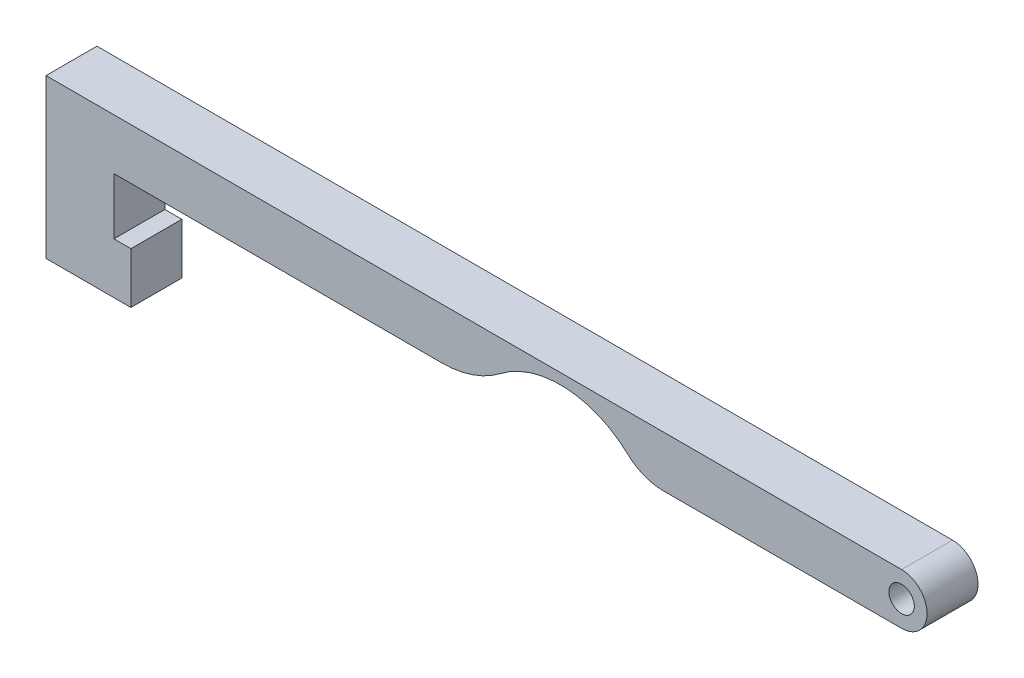
ISO-10303-21;
HEADER;
FILE_DESCRIPTION(('STEP AP214'),'2;1');
FILE_NAME('part.step','',(''),(''),'','','');
FILE_SCHEMA(('AUTOMOTIVE_DESIGN { 1 0 10303 214 1 1 1 1 }'));
ENDSEC;
DATA;
#1=APPLICATION_CONTEXT('core data for automotive mechanical design processes');
#2=APPLICATION_PROTOCOL_DEFINITION('international standard','automotive_design',2000,#1);
#3=PRODUCT_CONTEXT('',#1,'mechanical');
#4=PRODUCT('Part','Part','',(#3));
#5=PRODUCT_RELATED_PRODUCT_CATEGORY('part','',(#4));
#6=PRODUCT_DEFINITION_FORMATION('','',#4);
#7=PRODUCT_DEFINITION_CONTEXT('part definition',#1,'design');
#8=PRODUCT_DEFINITION('design','',#6,#7);
#9=PRODUCT_DEFINITION_SHAPE('','',#8);
#10=(LENGTH_UNIT() NAMED_UNIT(*) SI_UNIT(.MILLI.,.METRE.));
#11=(NAMED_UNIT(*) PLANE_ANGLE_UNIT() SI_UNIT($,.RADIAN.));
#12=(NAMED_UNIT(*) SI_UNIT($,.STERADIAN.) SOLID_ANGLE_UNIT());
#13=UNCERTAINTY_MEASURE_WITH_UNIT(LENGTH_MEASURE(1.E-05),#10,'distance_accuracy_value','');
#14=(GEOMETRIC_REPRESENTATION_CONTEXT(3) GLOBAL_UNCERTAINTY_ASSIGNED_CONTEXT((#13)) GLOBAL_UNIT_ASSIGNED_CONTEXT((#10,
#11,#12)) REPRESENTATION_CONTEXT('',''));
#15=CARTESIAN_POINT('',(0.,0.,0.));
#16=DIRECTION('',(0.,0.,1.));
#17=DIRECTION('',(1.,0.,0.));
#18=AXIS2_PLACEMENT_3D('',#15,#16,#17);
#19=CARTESIAN_POINT('',(503.852842171403,78.2849285036523,30.));
#20=DIRECTION('',(0.,0.,1.));
#21=DIRECTION('',(1.,0.,0.));
#22=AXIS2_PLACEMENT_3D('',#19,#20,#21);
#23=PLANE('',#22);
#24=DIRECTION('',(0.,1.,0.));
#25=VECTOR('',#24,1.);
#26=CARTESIAN_POINT('',(50.,30.,30.));
#27=LINE('',#26,#25);
#28=CARTESIAN_POINT('',(50.,0.,30.));
#29=VERTEX_POINT('',#28);
#30=CARTESIAN_POINT('',(50.,30.,30.));
#31=VERTEX_POINT('',#30);
#32=EDGE_CURVE('E200',#29,#31,#27,.T.);
#33=ORIENTED_EDGE('',*,*,#32,.T.);
#34=DIRECTION('',(-1.,0.,0.));
#35=VECTOR('',#34,1.);
#36=CARTESIAN_POINT('',(40.,30.,30.));
#37=LINE('',#36,#35);
#38=CARTESIAN_POINT('',(40.,30.,30.));
#39=VERTEX_POINT('',#38);
#40=EDGE_CURVE('E112',#31,#39,#37,.T.);
#41=ORIENTED_EDGE('',*,*,#40,.T.);
#42=DIRECTION('',(0.,1.,0.));
#43=VECTOR('',#42,1.);
#44=CARTESIAN_POINT('',(40.,63.2849285036523,30.));
#45=LINE('',#44,#43);
#46=CARTESIAN_POINT('',(40.,63.2849285036523,30.));
#47=VERTEX_POINT('',#46);
#48=EDGE_CURVE('E237',#39,#47,#45,.T.);
#49=ORIENTED_EDGE('',*,*,#48,.T.);
#50=DIRECTION('',(1.,0.,0.));
#51=VECTOR('',#50,1.);
#52=CARTESIAN_POINT('',(233.036577982899,63.2849285036523,30.));
#53=LINE('',#52,#51);
#54=CARTESIAN_POINT('',(233.036577982899,63.2849285036523,30.));
#55=VERTEX_POINT('',#54);
#56=EDGE_CURVE('E257',#47,#55,#53,.T.);
#57=ORIENTED_EDGE('',*,*,#56,.T.);
#58=CARTESIAN_POINT('',(233.036577982899,119.610355339386,30.));
#59=DIRECTION('',(0.,0.,1.));
#60=DIRECTION('',(-1.,0.,0.));
#61=AXIS2_PLACEMENT_3D('',#58,#59,#60);
#62=CIRCLE('',#61,56.3254268357336);
#63=CARTESIAN_POINT('',(267.394723934218,74.9777269716157,30.));
#64=VERTEX_POINT('',#63);
#65=EDGE_CURVE('E253',#55,#64,#62,.T.);
#66=ORIENTED_EDGE('',*,*,#65,.T.);
#67=CARTESIAN_POINT('',(302.941201104448,28.8014080407211,30.));
#68=DIRECTION('',(0.,0.,-1.));
#69=DIRECTION('',(1.,0.,0.));
#70=AXIS2_PLACEMENT_3D('',#67,#68,#69);
#71=CIRCLE('',#70,58.2735314634473);
#72=CARTESIAN_POINT('',(342.676664352432,71.4264878610504,30.));
#73=VERTEX_POINT('',#72);
#74=EDGE_CURVE('E256',#64,#73,#71,.T.);
#75=ORIENTED_EDGE('',*,*,#74,.T.);
#76=CARTESIAN_POINT('',(363.350187842499,93.6034179104629,30.));
#77=DIRECTION('',(0.,0.,1.));
#78=DIRECTION('',(-1.,0.,0.));
#79=AXIS2_PLACEMENT_3D('',#76,#77,#78);
#80=CIRCLE('',#79,30.3184894068106);
#81=CARTESIAN_POINT('',(363.350187842499,63.2849285036523,30.));
#82=VERTEX_POINT('',#81);
#83=EDGE_CURVE('E261',#73,#82,#80,.T.);
#84=ORIENTED_EDGE('',*,*,#83,.T.);
#85=DIRECTION('',(1.,0.,0.));
#86=VECTOR('',#85,1.);
#87=CARTESIAN_POINT('',(503.852842171403,63.2849285036523,30.));
#88=LINE('',#87,#86);
#89=CARTESIAN_POINT('',(503.852842171403,63.2849285036523,30.));
#90=VERTEX_POINT('',#89);
#91=EDGE_CURVE('E268',#82,#90,#88,.T.);
#92=ORIENTED_EDGE('',*,*,#91,.T.);
#93=CARTESIAN_POINT('',(503.852842171403,78.2849285036523,30.));
#94=DIRECTION('',(0.,0.,1.));
#95=DIRECTION('',(1.,0.,0.));
#96=AXIS2_PLACEMENT_3D('',#93,#94,#95);
#97=CIRCLE('',#96,15.);
#98=CARTESIAN_POINT('',(503.852842171403,93.2849285036523,30.));
#99=VERTEX_POINT('',#98);
#100=EDGE_CURVE('E143',#90,#99,#97,.T.);
#101=ORIENTED_EDGE('',*,*,#100,.T.);
#102=DIRECTION('',(-1.,0.,0.));
#103=VECTOR('',#102,1.);
#104=CARTESIAN_POINT('',(0.,93.2849285036523,30.));
#105=LINE('',#104,#103);
#106=CARTESIAN_POINT('',(0.,93.2849285036523,30.));
#107=VERTEX_POINT('',#106);
#108=EDGE_CURVE('E137',#99,#107,#105,.T.);
#109=ORIENTED_EDGE('',*,*,#108,.T.);
#110=DIRECTION('',(0.,-1.,0.));
#111=VECTOR('',#110,1.);
#112=CARTESIAN_POINT('',(0.,0.,30.));
#113=LINE('',#112,#111);
#114=CARTESIAN_POINT('',(0.,0.,30.));
#115=VERTEX_POINT('',#114);
#116=EDGE_CURVE('E141',#107,#115,#113,.T.);
#117=ORIENTED_EDGE('',*,*,#116,.T.);
#118=DIRECTION('',(1.,0.,0.));
#119=VECTOR('',#118,1.);
#120=CARTESIAN_POINT('',(50.,0.,30.));
#121=LINE('',#120,#119);
#122=EDGE_CURVE('E57',#115,#29,#121,.T.);
#123=ORIENTED_EDGE('',*,*,#122,.T.);
#124=EDGE_LOOP('',(#33,#41,#49,#57,#66,#75,#84,#92,#101,#109,#117,#123));
#125=FACE_BOUND('',#124,.T.);
#126=CARTESIAN_POINT('',(503.852842171403,78.2849285036523,30.));
#127=DIRECTION('',(0.,0.,1.));
#128=DIRECTION('',(1.,0.,0.));
#129=AXIS2_PLACEMENT_3D('',#126,#127,#128);
#130=CIRCLE('',#129,7.49999999999996);
#131=CARTESIAN_POINT('',(511.352842171403,78.2849285036523,30.));
#132=VERTEX_POINT('',#131);
#133=EDGE_CURVE('E170',#132,#132,#130,.T.);
#134=ORIENTED_EDGE('',*,*,#133,.F.);
#135=EDGE_LOOP('',(#134));
#136=FACE_BOUND('',#135,.T.);
#137=ADVANCED_FACE('F39',(#125,#136),#23,.T.);
#138=CARTESIAN_POINT('',(503.852842171403,78.2849285036523,0.));
#139=DIRECTION('',(0.,0.,1.));
#140=DIRECTION('',(1.,0.,0.));
#141=AXIS2_PLACEMENT_3D('',#138,#139,#140);
#142=PLANE('',#141);
#143=DIRECTION('',(0.,1.,0.));
#144=VECTOR('',#143,1.);
#145=CARTESIAN_POINT('',(50.,30.,0.));
#146=LINE('',#145,#144);
#147=CARTESIAN_POINT('',(50.,0.,0.));
#148=VERTEX_POINT('',#147);
#149=CARTESIAN_POINT('',(50.,30.,0.));
#150=VERTEX_POINT('',#149);
#151=EDGE_CURVE('E165',#148,#150,#146,.T.);
#152=ORIENTED_EDGE('',*,*,#151,.F.);
#153=DIRECTION('',(1.,0.,0.));
#154=VECTOR('',#153,1.);
#155=CARTESIAN_POINT('',(50.,0.,0.));
#156=LINE('',#155,#154);
#157=CARTESIAN_POINT('',(0.,0.,0.));
#158=VERTEX_POINT('',#157);
#159=EDGE_CURVE('E104',#158,#148,#156,.T.);
#160=ORIENTED_EDGE('',*,*,#159,.F.);
#161=DIRECTION('',(0.,-1.,0.));
#162=VECTOR('',#161,1.);
#163=CARTESIAN_POINT('',(0.,0.,0.));
#164=LINE('',#163,#162);
#165=CARTESIAN_POINT('',(0.,93.2849285036523,0.));
#166=VERTEX_POINT('',#165);
#167=EDGE_CURVE('E98',#166,#158,#164,.T.);
#168=ORIENTED_EDGE('',*,*,#167,.F.);
#169=DIRECTION('',(-1.,0.,0.));
#170=VECTOR('',#169,1.);
#171=CARTESIAN_POINT('',(0.,93.2849285036523,0.));
#172=LINE('',#171,#170);
#173=CARTESIAN_POINT('',(503.852842171403,93.2849285036523,0.));
#174=VERTEX_POINT('',#173);
#175=EDGE_CURVE('E152',#174,#166,#172,.T.);
#176=ORIENTED_EDGE('',*,*,#175,.F.);
#177=CARTESIAN_POINT('',(503.852842171403,78.2849285036523,0.));
#178=DIRECTION('',(0.,0.,1.));
#179=DIRECTION('',(1.,0.,0.));
#180=AXIS2_PLACEMENT_3D('',#177,#178,#179);
#181=CIRCLE('',#180,15.);
#182=CARTESIAN_POINT('',(503.852842171403,63.2849285036523,0.));
#183=VERTEX_POINT('',#182);
#184=EDGE_CURVE('E191',#183,#174,#181,.T.);
#185=ORIENTED_EDGE('',*,*,#184,.F.);
#186=DIRECTION('',(1.,0.,0.));
#187=VECTOR('',#186,1.);
#188=CARTESIAN_POINT('',(503.852842171403,63.2849285036523,0.));
#189=LINE('',#188,#187);
#190=CARTESIAN_POINT('',(363.350187842499,63.2849285036523,0.));
#191=VERTEX_POINT('',#190);
#192=EDGE_CURVE('E188',#191,#183,#189,.T.);
#193=ORIENTED_EDGE('',*,*,#192,.F.);
#194=CARTESIAN_POINT('',(363.350187842499,93.6034179104629,0.));
#195=DIRECTION('',(0.,0.,1.));
#196=DIRECTION('',(-1.,0.,0.));
#197=AXIS2_PLACEMENT_3D('',#194,#195,#196);
#198=CIRCLE('',#197,30.3184894068106);
#199=CARTESIAN_POINT('',(342.676664352432,71.4264878610504,0.));
#200=VERTEX_POINT('',#199);
#201=EDGE_CURVE('E185',#200,#191,#198,.T.);
#202=ORIENTED_EDGE('',*,*,#201,.F.);
#203=CARTESIAN_POINT('',(302.941201104448,28.8014080407211,0.));
#204=DIRECTION('',(0.,0.,-1.));
#205=DIRECTION('',(1.,0.,0.));
#206=AXIS2_PLACEMENT_3D('',#203,#204,#205);
#207=CIRCLE('',#206,58.2735314634473);
#208=CARTESIAN_POINT('',(267.394723934218,74.9777269716157,0.));
#209=VERTEX_POINT('',#208);
#210=EDGE_CURVE('E182',#209,#200,#207,.T.);
#211=ORIENTED_EDGE('',*,*,#210,.F.);
#212=CARTESIAN_POINT('',(233.036577982899,119.610355339386,0.));
#213=DIRECTION('',(0.,0.,1.));
#214=DIRECTION('',(-1.,0.,0.));
#215=AXIS2_PLACEMENT_3D('',#212,#213,#214);
#216=CIRCLE('',#215,56.3254268357336);
#217=CARTESIAN_POINT('',(233.036577982899,63.2849285036523,0.));
#218=VERTEX_POINT('',#217);
#219=EDGE_CURVE('E179',#218,#209,#216,.T.);
#220=ORIENTED_EDGE('',*,*,#219,.F.);
#221=DIRECTION('',(1.,0.,0.));
#222=VECTOR('',#221,1.);
#223=CARTESIAN_POINT('',(233.036577982899,63.2849285036523,0.));
#224=LINE('',#223,#222);
#225=CARTESIAN_POINT('',(40.,63.2849285036523,0.));
#226=VERTEX_POINT('',#225);
#227=EDGE_CURVE('E176',#226,#218,#224,.T.);
#228=ORIENTED_EDGE('',*,*,#227,.F.);
#229=DIRECTION('',(0.,1.,0.));
#230=VECTOR('',#229,1.);
#231=CARTESIAN_POINT('',(40.,63.2849285036523,0.));
#232=LINE('',#231,#230);
#233=CARTESIAN_POINT('',(40.,30.,0.));
#234=VERTEX_POINT('',#233);
#235=EDGE_CURVE('E173',#234,#226,#232,.T.);
#236=ORIENTED_EDGE('',*,*,#235,.F.);
#237=DIRECTION('',(-1.,0.,0.));
#238=VECTOR('',#237,1.);
#239=CARTESIAN_POINT('',(40.,30.,0.));
#240=LINE('',#239,#238);
#241=EDGE_CURVE('E169',#150,#234,#240,.T.);
#242=ORIENTED_EDGE('',*,*,#241,.F.);
#243=EDGE_LOOP('',(#152,#160,#168,#176,#185,#193,#202,#211,#220,#228,#236,#242));
#244=FACE_BOUND('',#243,.T.);
#245=CARTESIAN_POINT('',(503.852842171403,78.2849285036523,0.));
#246=DIRECTION('',(0.,0.,1.));
#247=DIRECTION('',(1.,0.,0.));
#248=AXIS2_PLACEMENT_3D('',#245,#246,#247);
#249=CIRCLE('',#248,7.49999999999996);
#250=CARTESIAN_POINT('',(511.352842171403,78.2849285036523,0.));
#251=VERTEX_POINT('',#250);
#252=EDGE_CURVE('E417',#251,#251,#249,.T.);
#253=ORIENTED_EDGE('',*,*,#252,.T.);
#254=EDGE_LOOP('',(#253));
#255=FACE_BOUND('',#254,.T.);
#256=ADVANCED_FACE('F241',(#244,#255),#142,.F.);
#257=CARTESIAN_POINT('',(50.,30.,30.));
#258=DIRECTION('',(-1.,0.,0.));
#259=DIRECTION('',(0.,0.,1.));
#260=AXIS2_PLACEMENT_3D('',#257,#258,#259);
#261=PLANE('',#260);
#262=ORIENTED_EDGE('',*,*,#151,.T.);
#263=DIRECTION('',(0.,0.,-1.));
#264=VECTOR('',#263,1.);
#265=CARTESIAN_POINT('',(50.,30.,30.));
#266=LINE('',#265,#264);
#267=EDGE_CURVE('E11',#31,#150,#266,.T.);
#268=ORIENTED_EDGE('',*,*,#267,.F.);
#269=ORIENTED_EDGE('',*,*,#32,.F.);
#270=DIRECTION('',(0.,0.,-1.));
#271=VECTOR('',#270,1.);
#272=CARTESIAN_POINT('',(50.,0.,30.));
#273=LINE('',#272,#271);
#274=EDGE_CURVE('E161',#29,#148,#273,.T.);
#275=ORIENTED_EDGE('',*,*,#274,.T.);
#276=EDGE_LOOP('',(#262,#268,#269,#275));
#277=FACE_BOUND('',#276,.T.);
#278=ADVANCED_FACE('F41',(#277),#261,.F.);
#279=CARTESIAN_POINT('',(40.,30.,30.));
#280=DIRECTION('',(0.,-1.,0.));
#281=DIRECTION('',(0.,0.,-1.));
#282=AXIS2_PLACEMENT_3D('',#279,#280,#281);
#283=PLANE('',#282);
#284=ORIENTED_EDGE('',*,*,#241,.T.);
#285=DIRECTION('',(0.,0.,-1.));
#286=VECTOR('',#285,1.);
#287=CARTESIAN_POINT('',(40.,30.,30.));
#288=LINE('',#287,#286);
#289=EDGE_CURVE('E49',#39,#234,#288,.T.);
#290=ORIENTED_EDGE('',*,*,#289,.F.);
#291=ORIENTED_EDGE('',*,*,#40,.F.);
#292=ORIENTED_EDGE('',*,*,#267,.T.);
#293=EDGE_LOOP('',(#284,#290,#291,#292));
#294=FACE_BOUND('',#293,.T.);
#295=ADVANCED_FACE('F304',(#294),#283,.F.);
#296=CARTESIAN_POINT('',(40.,63.2849285036523,30.));
#297=DIRECTION('',(-1.,0.,0.));
#298=DIRECTION('',(0.,0.,1.));
#299=AXIS2_PLACEMENT_3D('',#296,#297,#298);
#300=PLANE('',#299);
#301=ORIENTED_EDGE('',*,*,#235,.T.);
#302=DIRECTION('',(0.,0.,-1.));
#303=VECTOR('',#302,1.);
#304=CARTESIAN_POINT('',(40.,63.2849285036523,30.));
#305=LINE('',#304,#303);
#306=EDGE_CURVE('E227',#47,#226,#305,.T.);
#307=ORIENTED_EDGE('',*,*,#306,.F.);
#308=ORIENTED_EDGE('',*,*,#48,.F.);
#309=ORIENTED_EDGE('',*,*,#289,.T.);
#310=EDGE_LOOP('',(#301,#307,#308,#309));
#311=FACE_BOUND('',#310,.T.);
#312=ADVANCED_FACE('F235',(#311),#300,.F.);
#313=CARTESIAN_POINT('',(233.036577982899,63.2849285036523,30.));
#314=DIRECTION('',(0.,1.,0.));
#315=DIRECTION('',(-1.,0.,0.));
#316=AXIS2_PLACEMENT_3D('',#313,#314,#315);
#317=PLANE('',#316);
#318=ORIENTED_EDGE('',*,*,#227,.T.);
#319=DIRECTION('',(0.,0.,-1.));
#320=VECTOR('',#319,1.);
#321=CARTESIAN_POINT('',(233.036577982899,63.2849285036523,30.));
#322=LINE('',#321,#320);
#323=EDGE_CURVE('E223',#55,#218,#322,.T.);
#324=ORIENTED_EDGE('',*,*,#323,.F.);
#325=ORIENTED_EDGE('',*,*,#56,.F.);
#326=ORIENTED_EDGE('',*,*,#306,.T.);
#327=EDGE_LOOP('',(#318,#324,#325,#326));
#328=FACE_BOUND('',#327,.T.);
#329=ADVANCED_FACE('F247',(#328),#317,.F.);
#330=CARTESIAN_POINT('',(233.036577982899,119.610355339386,30.));
#331=DIRECTION('',(0.,0.,-1.));
#332=DIRECTION('',(-1.,0.,0.));
#333=AXIS2_PLACEMENT_3D('',#330,#331,#332);
#334=CYLINDRICAL_SURFACE('',#333,56.3254268357336);
#335=ORIENTED_EDGE('',*,*,#219,.T.);
#336=DIRECTION('',(0.,0.,-1.));
#337=VECTOR('',#336,1.);
#338=CARTESIAN_POINT('',(267.394723934218,74.9777269716157,30.));
#339=LINE('',#338,#337);
#340=EDGE_CURVE('E219',#64,#209,#339,.T.);
#341=ORIENTED_EDGE('',*,*,#340,.F.);
#342=ORIENTED_EDGE('',*,*,#65,.F.);
#343=ORIENTED_EDGE('',*,*,#323,.T.);
#344=EDGE_LOOP('',(#335,#341,#342,#343));
#345=FACE_BOUND('',#344,.T.);
#346=ADVANCED_FACE('F251',(#345),#334,.T.);
#347=CARTESIAN_POINT('',(302.941201104448,28.8014080407211,30.));
#348=DIRECTION('',(0.,0.,-1.));
#349=DIRECTION('',(-1.,0.,0.));
#350=AXIS2_PLACEMENT_3D('',#347,#348,#349);
#351=CYLINDRICAL_SURFACE('',#350,58.2735314634473);
#352=ORIENTED_EDGE('',*,*,#210,.T.);
#353=DIRECTION('',(0.,0.,-1.));
#354=VECTOR('',#353,1.);
#355=CARTESIAN_POINT('',(342.676664352432,71.4264878610504,30.));
#356=LINE('',#355,#354);
#357=EDGE_CURVE('E215',#73,#200,#356,.T.);
#358=ORIENTED_EDGE('',*,*,#357,.F.);
#359=ORIENTED_EDGE('',*,*,#74,.F.);
#360=ORIENTED_EDGE('',*,*,#340,.T.);
#361=EDGE_LOOP('',(#352,#358,#359,#360));
#362=FACE_BOUND('',#361,.T.);
#363=ADVANCED_FACE('F317',(#362),#351,.F.);
#364=CARTESIAN_POINT('',(363.350187842499,93.6034179104629,30.));
#365=DIRECTION('',(0.,0.,-1.));
#366=DIRECTION('',(-1.,0.,0.));
#367=AXIS2_PLACEMENT_3D('',#364,#365,#366);
#368=CYLINDRICAL_SURFACE('',#367,30.3184894068106);
#369=ORIENTED_EDGE('',*,*,#201,.T.);
#370=DIRECTION('',(0.,0.,-1.));
#371=VECTOR('',#370,1.);
#372=CARTESIAN_POINT('',(363.350187842499,63.2849285036523,30.));
#373=LINE('',#372,#371);
#374=EDGE_CURVE('E211',#82,#191,#373,.T.);
#375=ORIENTED_EDGE('',*,*,#374,.F.);
#376=ORIENTED_EDGE('',*,*,#83,.F.);
#377=ORIENTED_EDGE('',*,*,#357,.T.);
#378=EDGE_LOOP('',(#369,#375,#376,#377));
#379=FACE_BOUND('',#378,.T.);
#380=ADVANCED_FACE('F320',(#379),#368,.T.);
#381=CARTESIAN_POINT('',(503.852842171403,63.2849285036523,30.));
#382=DIRECTION('',(0.,1.,0.));
#383=DIRECTION('',(-1.,0.,0.));
#384=AXIS2_PLACEMENT_3D('',#381,#382,#383);
#385=PLANE('',#384);
#386=ORIENTED_EDGE('',*,*,#192,.T.);
#387=DIRECTION('',(0.,0.,-1.));
#388=VECTOR('',#387,1.);
#389=CARTESIAN_POINT('',(503.852842171403,63.2849285036523,30.));
#390=LINE('',#389,#388);
#391=EDGE_CURVE('E207',#90,#183,#390,.T.);
#392=ORIENTED_EDGE('',*,*,#391,.F.);
#393=ORIENTED_EDGE('',*,*,#91,.F.);
#394=ORIENTED_EDGE('',*,*,#374,.T.);
#395=EDGE_LOOP('',(#386,#392,#393,#394));
#396=FACE_BOUND('',#395,.T.);
#397=ADVANCED_FACE('F276',(#396),#385,.F.);
#398=CARTESIAN_POINT('',(503.852842171403,78.2849285036523,30.));
#399=DIRECTION('',(0.,0.,-1.));
#400=DIRECTION('',(-1.,0.,0.));
#401=AXIS2_PLACEMENT_3D('',#398,#399,#400);
#402=CYLINDRICAL_SURFACE('',#401,15.);
#403=ORIENTED_EDGE('',*,*,#184,.T.);
#404=DIRECTION('',(0.,0.,-1.));
#405=VECTOR('',#404,1.);
#406=CARTESIAN_POINT('',(503.852842171403,93.2849285036523,30.));
#407=LINE('',#406,#405);
#408=EDGE_CURVE('E154',#99,#174,#407,.T.);
#409=ORIENTED_EDGE('',*,*,#408,.F.);
#410=ORIENTED_EDGE('',*,*,#100,.F.);
#411=ORIENTED_EDGE('',*,*,#391,.T.);
#412=EDGE_LOOP('',(#403,#409,#410,#411));
#413=FACE_BOUND('',#412,.T.);
#414=ADVANCED_FACE('F280',(#413),#402,.T.);
#415=CARTESIAN_POINT('',(0.,93.2849285036523,30.));
#416=DIRECTION('',(0.,-1.,0.));
#417=DIRECTION('',(0.,0.,-1.));
#418=AXIS2_PLACEMENT_3D('',#415,#416,#417);
#419=PLANE('',#418);
#420=ORIENTED_EDGE('',*,*,#175,.T.);
#421=DIRECTION('',(0.,0.,-1.));
#422=VECTOR('',#421,1.);
#423=CARTESIAN_POINT('',(0.,93.2849285036523,30.));
#424=LINE('',#423,#422);
#425=EDGE_CURVE('E149',#107,#166,#424,.T.);
#426=ORIENTED_EDGE('',*,*,#425,.F.);
#427=ORIENTED_EDGE('',*,*,#108,.F.);
#428=ORIENTED_EDGE('',*,*,#408,.T.);
#429=EDGE_LOOP('',(#420,#426,#427,#428));
#430=FACE_BOUND('',#429,.T.);
#431=ADVANCED_FACE('F150',(#430),#419,.F.);
#432=CARTESIAN_POINT('',(0.,0.,30.));
#433=DIRECTION('',(1.,0.,0.));
#434=DIRECTION('',(0.,0.,-1.));
#435=AXIS2_PLACEMENT_3D('',#432,#433,#434);
#436=PLANE('',#435);
#437=ORIENTED_EDGE('',*,*,#167,.T.);
#438=DIRECTION('',(0.,0.,-1.));
#439=VECTOR('',#438,1.);
#440=CARTESIAN_POINT('',(0.,0.,30.));
#441=LINE('',#440,#439);
#442=EDGE_CURVE('E155',#115,#158,#441,.T.);
#443=ORIENTED_EDGE('',*,*,#442,.F.);
#444=ORIENTED_EDGE('',*,*,#116,.F.);
#445=ORIENTED_EDGE('',*,*,#425,.T.);
#446=EDGE_LOOP('',(#437,#443,#444,#445));
#447=FACE_BOUND('',#446,.T.);
#448=ADVANCED_FACE('F157',(#447),#436,.F.);
#449=CARTESIAN_POINT('',(50.,0.,30.));
#450=DIRECTION('',(0.,1.,0.));
#451=DIRECTION('',(-1.,0.,0.));
#452=AXIS2_PLACEMENT_3D('',#449,#450,#451);
#453=PLANE('',#452);
#454=ORIENTED_EDGE('',*,*,#159,.T.);
#455=ORIENTED_EDGE('',*,*,#274,.F.);
#456=ORIENTED_EDGE('',*,*,#122,.F.);
#457=ORIENTED_EDGE('',*,*,#442,.T.);
#458=EDGE_LOOP('',(#454,#455,#456,#457));
#459=FACE_BOUND('',#458,.T.);
#460=ADVANCED_FACE('F284',(#459),#453,.F.);
#461=CARTESIAN_POINT('',(503.852842171403,78.2849285036523,30.));
#462=DIRECTION('',(0.,0.,-1.));
#463=DIRECTION('',(-1.,0.,0.));
#464=AXIS2_PLACEMENT_3D('',#461,#462,#463);
#465=CYLINDRICAL_SURFACE('',#464,7.49999999999996);
#466=ORIENTED_EDGE('',*,*,#133,.T.);
#467=EDGE_LOOP('',(#466));
#468=FACE_BOUND('',#467,.T.);
#469=ORIENTED_EDGE('',*,*,#252,.F.);
#470=EDGE_LOOP('',(#469));
#471=FACE_BOUND('',#470,.T.);
#472=ADVANCED_FACE('F286',(#468,#471),#465,.F.);
#473=CLOSED_SHELL('',(#137,#256,#278,#295,#312,#329,#346,#363,#380,#397,#414,#431,#448,#460,#472));
#474=MANIFOLD_SOLID_BREP('B2',#473);
#475=ADVANCED_BREP_SHAPE_REPRESENTATION('',(#18,#474),#14);
#476=SHAPE_DEFINITION_REPRESENTATION(#9,#475);
ENDSEC;
END-ISO-10303-21;
